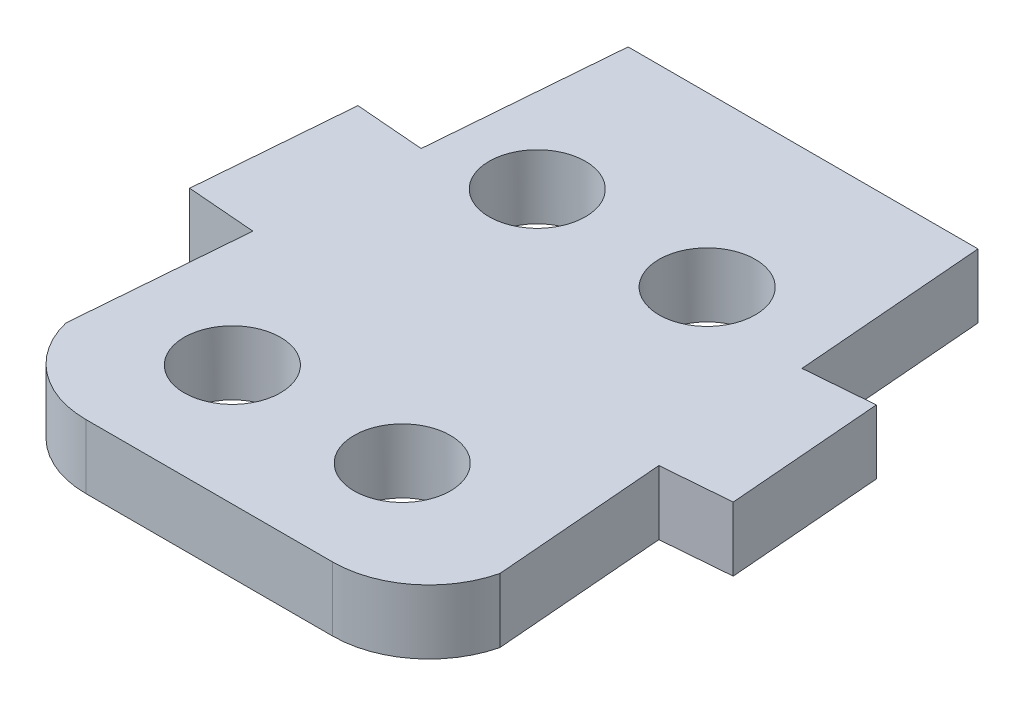
ISO-10303-21;
HEADER;
FILE_DESCRIPTION(('STEP AP214'),'2;1');
FILE_NAME('part.step','',(''),(''),'','','');
FILE_SCHEMA(('AUTOMOTIVE_DESIGN { 1 0 10303 214 1 1 1 1 }'));
ENDSEC;
DATA;
#1=APPLICATION_CONTEXT('core data for automotive mechanical design processes');
#2=APPLICATION_PROTOCOL_DEFINITION('international standard','automotive_design',2000,#1);
#3=PRODUCT_CONTEXT('',#1,'mechanical');
#4=PRODUCT('Part','Part','',(#3));
#5=PRODUCT_RELATED_PRODUCT_CATEGORY('part','',(#4));
#6=PRODUCT_DEFINITION_FORMATION('','',#4);
#7=PRODUCT_DEFINITION_CONTEXT('part definition',#1,'design');
#8=PRODUCT_DEFINITION('design','',#6,#7);
#9=PRODUCT_DEFINITION_SHAPE('','',#8);
#10=(LENGTH_UNIT() NAMED_UNIT(*) SI_UNIT(.MILLI.,.METRE.));
#11=(NAMED_UNIT(*) PLANE_ANGLE_UNIT() SI_UNIT($,.RADIAN.));
#12=(NAMED_UNIT(*) SI_UNIT($,.STERADIAN.) SOLID_ANGLE_UNIT());
#13=UNCERTAINTY_MEASURE_WITH_UNIT(LENGTH_MEASURE(1.E-05),#10,'distance_accuracy_value','');
#14=(GEOMETRIC_REPRESENTATION_CONTEXT(3) GLOBAL_UNCERTAINTY_ASSIGNED_CONTEXT((#13)) GLOBAL_UNIT_ASSIGNED_CONTEXT((#10,
#11,#12)) REPRESENTATION_CONTEXT('',''));
#15=CARTESIAN_POINT('',(0.,0.,0.));
#16=DIRECTION('',(0.,0.,1.));
#17=DIRECTION('',(1.,0.,0.));
#18=AXIS2_PLACEMENT_3D('',#15,#16,#17);
#19=CARTESIAN_POINT('',(-6.06125458711674,-48.,82.5));
#20=DIRECTION('',(0.,1.,0.));
#21=DIRECTION('',(0.,0.,1.));
#22=AXIS2_PLACEMENT_3D('',#19,#20,#21);
#23=CYLINDRICAL_SURFACE('',#22,3.);
#24=CARTESIAN_POINT('',(-6.06125458711674,-48.,82.5));
#25=DIRECTION('',(0.,1.,0.));
#26=DIRECTION('',(0.,0.,1.));
#27=AXIS2_PLACEMENT_3D('',#24,#25,#26);
#28=CIRCLE('',#27,3.);
#29=CARTESIAN_POINT('',(-6.06125458711674,-48.,85.5));
#30=VERTEX_POINT('',#29);
#31=EDGE_CURVE('E233',#30,#30,#28,.T.);
#32=ORIENTED_EDGE('',*,*,#31,.F.);
#33=EDGE_LOOP('',(#32));
#34=FACE_BOUND('',#33,.T.);
#35=CARTESIAN_POINT('',(-6.06125458711674,-44.,82.5));
#36=DIRECTION('',(0.,-1.,0.));
#37=DIRECTION('',(0.,0.,-1.));
#38=AXIS2_PLACEMENT_3D('',#35,#36,#37);
#39=CIRCLE('',#38,3.);
#40=CARTESIAN_POINT('',(-6.06125458711674,-44.,79.5));
#41=VERTEX_POINT('',#40);
#42=EDGE_CURVE('E259',#41,#41,#39,.T.);
#43=ORIENTED_EDGE('',*,*,#42,.F.);
#44=EDGE_LOOP('',(#43));
#45=FACE_BOUND('',#44,.T.);
#46=ADVANCED_FACE('F40',(#34,#45),#23,.F.);
#47=CARTESIAN_POINT('',(4.5257367583805,-48.,82.5));
#48=DIRECTION('',(0.,1.,0.));
#49=DIRECTION('',(0.,0.,1.));
#50=AXIS2_PLACEMENT_3D('',#47,#48,#49);
#51=CYLINDRICAL_SURFACE('',#50,3.);
#52=CARTESIAN_POINT('',(4.5257367583805,-48.,82.5));
#53=DIRECTION('',(0.,1.,0.));
#54=DIRECTION('',(0.,0.,1.));
#55=AXIS2_PLACEMENT_3D('',#52,#53,#54);
#56=CIRCLE('',#55,3.);
#57=CARTESIAN_POINT('',(4.5257367583805,-48.,85.5));
#58=VERTEX_POINT('',#57);
#59=EDGE_CURVE('E241',#58,#58,#56,.T.);
#60=ORIENTED_EDGE('',*,*,#59,.F.);
#61=EDGE_LOOP('',(#60));
#62=FACE_BOUND('',#61,.T.);
#63=CARTESIAN_POINT('',(4.5257367583805,-44.,82.5));
#64=DIRECTION('',(0.,-1.,0.));
#65=DIRECTION('',(0.,0.,-1.));
#66=AXIS2_PLACEMENT_3D('',#63,#64,#65);
#67=CIRCLE('',#66,3.);
#68=CARTESIAN_POINT('',(4.5257367583805,-44.,79.5));
#69=VERTEX_POINT('',#68);
#70=EDGE_CURVE('E222',#69,#69,#67,.T.);
#71=ORIENTED_EDGE('',*,*,#70,.F.);
#72=EDGE_LOOP('',(#71));
#73=FACE_BOUND('',#72,.T.);
#74=ADVANCED_FACE('F349',(#62,#73),#51,.F.);
#75=CARTESIAN_POINT('',(-7.68737021403695,-48.,84.));
#76=DIRECTION('',(0.,-1.,0.));
#77=DIRECTION('',(1.,0.,0.));
#78=AXIS2_PLACEMENT_3D('',#75,#76,#77);
#79=CYLINDRICAL_SURFACE('',#78,6.);
#80=CARTESIAN_POINT('',(-7.68737021403695,-44.,84.));
#81=DIRECTION('',(0.,-1.,0.));
#82=DIRECTION('',(0.,0.,-1.));
#83=AXIS2_PLACEMENT_3D('',#80,#81,#82);
#84=CIRCLE('',#83,6.);
#85=CARTESIAN_POINT('',(-13.5197646184237,-44.,85.4082526448327));
#86=VERTEX_POINT('',#85);
#87=CARTESIAN_POINT('',(-7.68737021403695,-44.,90.));
#88=VERTEX_POINT('',#87);
#89=EDGE_CURVE('E202',#86,#88,#84,.F.);
#90=ORIENTED_EDGE('',*,*,#89,.F.);
#91=DIRECTION('',(0.,-1.,0.));
#92=VECTOR('',#91,1.);
#93=CARTESIAN_POINT('',(-13.5197646184237,-48.,85.4082526448327));
#94=LINE('',#93,#92);
#95=CARTESIAN_POINT('',(-13.5197646184237,-48.,85.4082526448327));
#96=VERTEX_POINT('',#95);
#97=EDGE_CURVE('E168',#86,#96,#94,.T.);
#98=ORIENTED_EDGE('',*,*,#97,.T.);
#99=CARTESIAN_POINT('',(-7.68737021403695,-48.,84.));
#100=DIRECTION('',(0.,-1.,0.));
#101=DIRECTION('',(0.,0.,-1.));
#102=AXIS2_PLACEMENT_3D('',#99,#100,#101);
#103=CIRCLE('',#102,6.);
#104=CARTESIAN_POINT('',(-7.68737021403695,-48.,90.));
#105=VERTEX_POINT('',#104);
#106=EDGE_CURVE('E206',#105,#96,#103,.T.);
#107=ORIENTED_EDGE('',*,*,#106,.F.);
#108=DIRECTION('',(0.,1.,0.));
#109=VECTOR('',#108,1.);
#110=CARTESIAN_POINT('',(-7.68737021403695,-48.,90.));
#111=LINE('',#110,#109);
#112=EDGE_CURVE('E93',#88,#105,#111,.F.);
#113=ORIENTED_EDGE('',*,*,#112,.F.);
#114=EDGE_LOOP('',(#90,#98,#107,#113));
#115=FACE_BOUND('',#114,.T.);
#116=ADVANCED_FACE('F328',(#115),#79,.T.);
#117=CARTESIAN_POINT('',(15.,-48.,90.));
#118=DIRECTION('',(0.,0.,1.));
#119=DIRECTION('',(1.,0.,0.));
#120=AXIS2_PLACEMENT_3D('',#117,#118,#119);
#121=PLANE('',#120);
#122=DIRECTION('',(-1.,0.,0.));
#123=VECTOR('',#122,1.);
#124=CARTESIAN_POINT('',(15.,-48.,90.));
#125=LINE('',#124,#123);
#126=CARTESIAN_POINT('',(7.68737021403695,-48.,90.));
#127=VERTEX_POINT('',#126);
#128=EDGE_CURVE('E269',#127,#105,#125,.T.);
#129=ORIENTED_EDGE('',*,*,#128,.F.);
#130=DIRECTION('',(0.,-1.,0.));
#131=VECTOR('',#130,1.);
#132=CARTESIAN_POINT('',(7.68737021403695,-44.,90.));
#133=LINE('',#132,#131);
#134=CARTESIAN_POINT('',(7.68737021403695,-44.,90.));
#135=VERTEX_POINT('',#134);
#136=EDGE_CURVE('E195',#127,#135,#133,.F.);
#137=ORIENTED_EDGE('',*,*,#136,.T.);
#138=DIRECTION('',(-1.,0.,0.));
#139=VECTOR('',#138,1.);
#140=CARTESIAN_POINT('',(15.,-44.,90.));
#141=LINE('',#140,#139);
#142=EDGE_CURVE('E272',#135,#88,#141,.T.);
#143=ORIENTED_EDGE('',*,*,#142,.T.);
#144=ORIENTED_EDGE('',*,*,#112,.T.);
#145=EDGE_LOOP('',(#129,#137,#143,#144));
#146=FACE_BOUND('',#145,.T.);
#147=ADVANCED_FACE('F340',(#146),#121,.T.);
#148=CARTESIAN_POINT('',(7.68737021403695,-48.,84.));
#149=DIRECTION('',(0.,1.,0.));
#150=DIRECTION('',(-1.,0.,0.));
#151=AXIS2_PLACEMENT_3D('',#148,#149,#150);
#152=CYLINDRICAL_SURFACE('',#151,6.);
#153=CARTESIAN_POINT('',(7.68737021403695,-48.,84.));
#154=DIRECTION('',(0.,-1.,0.));
#155=DIRECTION('',(0.,0.,-1.));
#156=AXIS2_PLACEMENT_3D('',#153,#154,#155);
#157=CIRCLE('',#156,6.);
#158=CARTESIAN_POINT('',(13.5197646184237,-48.,85.4082526448327));
#159=VERTEX_POINT('',#158);
#160=EDGE_CURVE('E236',#159,#127,#157,.T.);
#161=ORIENTED_EDGE('',*,*,#160,.F.);
#162=DIRECTION('',(0.,1.,0.));
#163=VECTOR('',#162,1.);
#164=CARTESIAN_POINT('',(13.5197646184237,-48.,85.4082526448327));
#165=LINE('',#164,#163);
#166=CARTESIAN_POINT('',(13.5197646184237,-44.,85.4082526448327));
#167=VERTEX_POINT('',#166);
#168=EDGE_CURVE('E173',#159,#167,#165,.T.);
#169=ORIENTED_EDGE('',*,*,#168,.T.);
#170=CARTESIAN_POINT('',(7.68737021403695,-44.,84.));
#171=DIRECTION('',(0.,-1.,0.));
#172=DIRECTION('',(0.,0.,-1.));
#173=AXIS2_PLACEMENT_3D('',#170,#171,#172);
#174=CIRCLE('',#173,6.);
#175=EDGE_CURVE('E223',#135,#167,#174,.F.);
#176=ORIENTED_EDGE('',*,*,#175,.F.);
#177=ORIENTED_EDGE('',*,*,#136,.F.);
#178=EDGE_LOOP('',(#161,#169,#176,#177));
#179=FACE_BOUND('',#178,.T.);
#180=ADVANCED_FACE('F339',(#179),#152,.T.);
#181=CARTESIAN_POINT('',(4.5257367583805,-48.,63.5));
#182=DIRECTION('',(0.,1.,0.));
#183=DIRECTION('',(0.,0.,1.));
#184=AXIS2_PLACEMENT_3D('',#181,#182,#183);
#185=CYLINDRICAL_SURFACE('',#184,3.);
#186=CARTESIAN_POINT('',(4.5257367583805,-48.,63.5));
#187=DIRECTION('',(0.,1.,0.));
#188=DIRECTION('',(0.,0.,1.));
#189=AXIS2_PLACEMENT_3D('',#186,#187,#188);
#190=CIRCLE('',#189,3.);
#191=CARTESIAN_POINT('',(4.5257367583805,-48.,66.5));
#192=VERTEX_POINT('',#191);
#193=EDGE_CURVE('E176',#192,#192,#190,.T.);
#194=ORIENTED_EDGE('',*,*,#193,.F.);
#195=EDGE_LOOP('',(#194));
#196=FACE_BOUND('',#195,.T.);
#197=CARTESIAN_POINT('',(4.5257367583805,-44.,63.5));
#198=DIRECTION('',(0.,-1.,0.));
#199=DIRECTION('',(0.,0.,-1.));
#200=AXIS2_PLACEMENT_3D('',#197,#198,#199);
#201=CIRCLE('',#200,3.);
#202=CARTESIAN_POINT('',(4.5257367583805,-44.,60.5));
#203=VERTEX_POINT('',#202);
#204=EDGE_CURVE('E191',#203,#203,#201,.T.);
#205=ORIENTED_EDGE('',*,*,#204,.F.);
#206=EDGE_LOOP('',(#205));
#207=FACE_BOUND('',#206,.T.);
#208=ADVANCED_FACE('F347',(#196,#207),#185,.F.);
#209=CARTESIAN_POINT('',(-6.06125458711674,-48.,63.5));
#210=DIRECTION('',(0.,1.,0.));
#211=DIRECTION('',(0.,0.,1.));
#212=AXIS2_PLACEMENT_3D('',#209,#210,#211);
#213=CYLINDRICAL_SURFACE('',#212,3.);
#214=CARTESIAN_POINT('',(-6.06125458711674,-48.,63.5));
#215=DIRECTION('',(0.,1.,0.));
#216=DIRECTION('',(0.,0.,1.));
#217=AXIS2_PLACEMENT_3D('',#214,#215,#216);
#218=CIRCLE('',#217,3.);
#219=CARTESIAN_POINT('',(-6.06125458711674,-48.,66.5));
#220=VERTEX_POINT('',#219);
#221=EDGE_CURVE('E245',#220,#220,#218,.T.);
#222=ORIENTED_EDGE('',*,*,#221,.F.);
#223=EDGE_LOOP('',(#222));
#224=FACE_BOUND('',#223,.T.);
#225=CARTESIAN_POINT('',(-6.06125458711674,-44.,63.5));
#226=DIRECTION('',(0.,-1.,0.));
#227=DIRECTION('',(0.,0.,-1.));
#228=AXIS2_PLACEMENT_3D('',#225,#226,#227);
#229=CIRCLE('',#228,3.);
#230=CARTESIAN_POINT('',(-6.06125458711674,-44.,60.5));
#231=VERTEX_POINT('',#230);
#232=EDGE_CURVE('E254',#231,#231,#229,.T.);
#233=ORIENTED_EDGE('',*,*,#232,.F.);
#234=EDGE_LOOP('',(#233));
#235=FACE_BOUND('',#234,.T.);
#236=ADVANCED_FACE('F363',(#224,#235),#213,.F.);
#237=CARTESIAN_POINT('',(-12.6489432642371,-49.9335699268317,74.6329914137981));
#238=DIRECTION('',(-0.0805540927453614,0.,0.996750238596396));
#239=DIRECTION('',(0.996750238596396,0.,0.0805540927453614));
#240=AXIS2_PLACEMENT_3D('',#237,#238,#239);
#241=PLANE('',#240);
#242=DIRECTION('',(-0.996750238596396,0.,-0.0805540927453614));
#243=VECTOR('',#242,1.);
#244=CARTESIAN_POINT('',(13.3245011172335,-44.,76.7320801991369));
#245=LINE('',#244,#243);
#246=CARTESIAN_POINT('',(-12.6489432642371,-44.,74.6329914137981));
#247=VERTEX_POINT('',#246);
#248=CARTESIAN_POINT('',(-16.9349692902016,-44.,74.286608814993));
#249=VERTEX_POINT('',#248);
#250=EDGE_CURVE('E207',#247,#249,#245,.T.);
#251=ORIENTED_EDGE('',*,*,#250,.T.);
#252=DIRECTION('',(0.,1.,0.));
#253=VECTOR('',#252,1.);
#254=CARTESIAN_POINT('',(-16.9349692902016,-49.9335699268317,74.286608814993));
#255=LINE('',#254,#253);
#256=CARTESIAN_POINT('',(-16.9349692902016,-48.,74.286608814993));
#257=VERTEX_POINT('',#256);
#258=EDGE_CURVE('E171',#257,#249,#255,.T.);
#259=ORIENTED_EDGE('',*,*,#258,.F.);
#260=DIRECTION('',(-0.996750238596396,0.,-0.0805540927453614));
#261=VECTOR('',#260,1.);
#262=CARTESIAN_POINT('',(13.3245011172335,-48.,76.7320801991369));
#263=LINE('',#262,#261);
#264=CARTESIAN_POINT('',(-12.6489432642371,-48.,74.6329914137981));
#265=VERTEX_POINT('',#264);
#266=EDGE_CURVE('E203',#265,#257,#263,.T.);
#267=ORIENTED_EDGE('',*,*,#266,.F.);
#268=DIRECTION('',(0.,1.,0.));
#269=VECTOR('',#268,1.);
#270=CARTESIAN_POINT('',(-12.6489432642371,-49.9335699268317,74.6329914137981));
#271=LINE('',#270,#269);
#272=EDGE_CURVE('E209',#265,#247,#271,.T.);
#273=ORIENTED_EDGE('',*,*,#272,.T.);
#274=EDGE_LOOP('',(#251,#259,#267,#273));
#275=FACE_BOUND('',#274,.T.);
#276=ADVANCED_FACE('F318',(#275),#241,.T.);
#277=CARTESIAN_POINT('',(-15.4310649299438,-45.,55.6777836290186));
#278=DIRECTION('',(-0.996750238596396,0.,-0.0805540927453614));
#279=DIRECTION('',(0.0805540927453614,0.,-0.996750238596396));
#280=AXIS2_PLACEMENT_3D('',#277,#278,#279);
#281=PLANE('',#280);
#282=DIRECTION('',(0.0805540927453614,0.,-0.996750238596396));
#283=VECTOR('',#282,1.);
#284=CARTESIAN_POINT('',(-15.4310649299438,-48.,55.6777836290186));
#285=LINE('',#284,#283);
#286=CARTESIAN_POINT('',(-16.150968239743,-48.,64.5856338865719));
#287=VERTEX_POINT('',#286);
#288=EDGE_CURVE('E205',#257,#287,#285,.T.);
#289=ORIENTED_EDGE('',*,*,#288,.F.);
#290=ORIENTED_EDGE('',*,*,#258,.T.);
#291=DIRECTION('',(0.0805540927453614,0.,-0.996750238596396));
#292=VECTOR('',#291,1.);
#293=CARTESIAN_POINT('',(-15.4310649299438,-44.,55.6777836290186));
#294=LINE('',#293,#292);
#295=CARTESIAN_POINT('',(-16.150968239743,-44.,64.5856338865719));
#296=VERTEX_POINT('',#295);
#297=EDGE_CURVE('E196',#249,#296,#294,.T.);
#298=ORIENTED_EDGE('',*,*,#297,.T.);
#299=DIRECTION('',(0.,-1.,0.));
#300=VECTOR('',#299,1.);
#301=CARTESIAN_POINT('',(-16.150968239743,-43.7,64.5856338865719));
#302=LINE('',#301,#300);
#303=EDGE_CURVE('E192',#296,#287,#302,.T.);
#304=ORIENTED_EDGE('',*,*,#303,.T.);
#305=EDGE_LOOP('',(#289,#290,#298,#304));
#306=FACE_BOUND('',#305,.T.);
#307=ADVANCED_FACE('F315',(#306),#281,.T.);
#308=CARTESIAN_POINT('',(15.4310649299438,-45.,55.6777836290186));
#309=DIRECTION('',(0.996750238596396,0.,-0.0805540927453614));
#310=DIRECTION('',(-0.0805540927453614,0.,-0.996750238596396));
#311=AXIS2_PLACEMENT_3D('',#308,#309,#310);
#312=PLANE('',#311);
#313=DIRECTION('',(0.,1.,0.));
#314=VECTOR('',#313,1.);
#315=CARTESIAN_POINT('',(16.9349692902016,-49.9335699268317,74.286608814993));
#316=LINE('',#315,#314);
#317=CARTESIAN_POINT('',(16.9349692902016,-48.,74.286608814993));
#318=VERTEX_POINT('',#317);
#319=CARTESIAN_POINT('',(16.9349692902016,-44.,74.286608814993));
#320=VERTEX_POINT('',#319);
#321=EDGE_CURVE('E50',#318,#320,#316,.T.);
#322=ORIENTED_EDGE('',*,*,#321,.F.);
#323=DIRECTION('',(-0.0805540927453614,0.,-0.996750238596396));
#324=VECTOR('',#323,1.);
#325=CARTESIAN_POINT('',(15.4310649299438,-48.,55.6777836290186));
#326=LINE('',#325,#324);
#327=CARTESIAN_POINT('',(16.150968239743,-48.,64.5856338865719));
#328=VERTEX_POINT('',#327);
#329=EDGE_CURVE('E44',#318,#328,#326,.T.);
#330=ORIENTED_EDGE('',*,*,#329,.T.);
#331=DIRECTION('',(0.,-1.,0.));
#332=VECTOR('',#331,1.);
#333=CARTESIAN_POINT('',(16.150968239743,-43.7,64.5856338865719));
#334=LINE('',#333,#332);
#335=CARTESIAN_POINT('',(16.150968239743,-44.,64.5856338865719));
#336=VERTEX_POINT('',#335);
#337=EDGE_CURVE('E145',#336,#328,#334,.T.);
#338=ORIENTED_EDGE('',*,*,#337,.F.);
#339=DIRECTION('',(0.0805540927453614,0.,0.996750238596396));
#340=VECTOR('',#339,1.);
#341=CARTESIAN_POINT('',(15.4310649299438,-44.,55.6777836290186));
#342=LINE('',#341,#340);
#343=EDGE_CURVE('E158',#336,#320,#342,.T.);
#344=ORIENTED_EDGE('',*,*,#343,.T.);
#345=EDGE_LOOP('',(#322,#330,#338,#344));
#346=FACE_BOUND('',#345,.T.);
#347=ADVANCED_FACE('F42',(#346),#312,.T.);
#348=CARTESIAN_POINT('',(12.6489432642371,-49.9335699268317,74.6329914137981));
#349=DIRECTION('',(-0.0805540927453614,0.,-0.996750238596396));
#350=DIRECTION('',(-0.996750238596396,0.,0.0805540927453614));
#351=AXIS2_PLACEMENT_3D('',#348,#349,#350);
#352=PLANE('',#351);
#353=ORIENTED_EDGE('',*,*,#321,.T.);
#354=DIRECTION('',(0.996750238596396,0.,-0.0805540927453614));
#355=VECTOR('',#354,1.);
#356=CARTESIAN_POINT('',(16.4808300270257,-44.,74.3233108642212));
#357=LINE('',#356,#355);
#358=CARTESIAN_POINT('',(12.6489432642371,-44.,74.6329914137981));
#359=VERTEX_POINT('',#358);
#360=EDGE_CURVE('E154',#359,#320,#357,.T.);
#361=ORIENTED_EDGE('',*,*,#360,.F.);
#362=DIRECTION('',(0.,1.,0.));
#363=VECTOR('',#362,1.);
#364=CARTESIAN_POINT('',(12.6489432642371,-49.9335699268317,74.6329914137981));
#365=LINE('',#364,#363);
#366=CARTESIAN_POINT('',(12.6489432642371,-48.,74.6329914137981));
#367=VERTEX_POINT('',#366);
#368=EDGE_CURVE('E228',#367,#359,#365,.T.);
#369=ORIENTED_EDGE('',*,*,#368,.F.);
#370=DIRECTION('',(0.996750238596396,0.,-0.0805540927453614));
#371=VECTOR('',#370,1.);
#372=CARTESIAN_POINT('',(16.4808300270257,-48.,74.3233108642212));
#373=LINE('',#372,#371);
#374=EDGE_CURVE('E11',#367,#318,#373,.T.);
#375=ORIENTED_EDGE('',*,*,#374,.T.);
#376=EDGE_LOOP('',(#353,#361,#369,#375));
#377=FACE_BOUND('',#376,.T.);
#378=ADVANCED_FACE('F335',(#377),#352,.F.);
#379=CARTESIAN_POINT('',(6.57440938416514,0.,-0.53132225383139));
#380=DIRECTION('',(-0.996750238596396,0.,0.0805540927453614));
#381=DIRECTION('',(-0.0805540927453614,0.,-0.996750238596396));
#382=AXIS2_PLACEMENT_3D('',#379,#380,#381);
#383=PLANE('',#382);
#384=DIRECTION('',(-0.0805540927453614,0.,-0.996750238596396));
#385=VECTOR('',#384,1.);
#386=CARTESIAN_POINT('',(11.1681132372115,-44.,56.3096805495769));
#387=LINE('',#386,#385);
#388=EDGE_CURVE('E221',#167,#359,#387,.T.);
#389=ORIENTED_EDGE('',*,*,#388,.F.);
#390=ORIENTED_EDGE('',*,*,#168,.F.);
#391=DIRECTION('',(-0.0805540927453614,0.,-0.996750238596396));
#392=VECTOR('',#391,1.);
#393=CARTESIAN_POINT('',(11.1681132372115,-48.,56.3096805495769));
#394=LINE('',#393,#392);
#395=EDGE_CURVE('E161',#159,#367,#394,.T.);
#396=ORIENTED_EDGE('',*,*,#395,.T.);
#397=ORIENTED_EDGE('',*,*,#368,.T.);
#398=EDGE_LOOP('',(#389,#390,#396,#397));
#399=FACE_BOUND('',#398,.T.);
#400=ADVANCED_FACE('F334',(#399),#383,.F.);
#401=CARTESIAN_POINT('',(-6.57440938416514,0.,-0.53132225383139));
#402=DIRECTION('',(0.996750238596396,0.,0.0805540927453614));
#403=DIRECTION('',(0.0805540927453614,0.,-0.996750238596396));
#404=AXIS2_PLACEMENT_3D('',#401,#402,#403);
#405=PLANE('',#404);
#406=ORIENTED_EDGE('',*,*,#272,.F.);
#407=DIRECTION('',(-0.0805540927453614,0.,0.996750238596396));
#408=VECTOR('',#407,1.);
#409=CARTESIAN_POINT('',(-10.9734443814706,-48.,53.9009112146612));
#410=LINE('',#409,#408);
#411=EDGE_CURVE('E199',#265,#96,#410,.T.);
#412=ORIENTED_EDGE('',*,*,#411,.T.);
#413=ORIENTED_EDGE('',*,*,#97,.F.);
#414=DIRECTION('',(-0.0805540927453614,0.,0.996750238596396));
#415=VECTOR('',#414,1.);
#416=CARTESIAN_POINT('',(-10.9734443814706,-44.,53.9009112146612));
#417=LINE('',#416,#415);
#418=EDGE_CURVE('E182',#247,#86,#417,.T.);
#419=ORIENTED_EDGE('',*,*,#418,.F.);
#420=EDGE_LOOP('',(#406,#412,#413,#419));
#421=FACE_BOUND('',#420,.T.);
#422=ADVANCED_FACE('F324',(#421),#405,.F.);
#423=CARTESIAN_POINT('',(-11.8649422137785,-43.7,64.932016485377));
#424=DIRECTION('',(0.0805540927453614,0.,-0.996750238596396));
#425=DIRECTION('',(-0.996750238596396,0.,-0.0805540927453614));
#426=AXIS2_PLACEMENT_3D('',#423,#424,#425);
#427=PLANE('',#426);
#428=DIRECTION('',(0.996750238596396,0.,0.0805540927453614));
#429=VECTOR('',#428,1.);
#430=CARTESIAN_POINT('',(14.1085021676921,-44.,67.0311052707158));
#431=LINE('',#430,#429);
#432=CARTESIAN_POINT('',(-11.8649422137785,-44.,64.932016485377));
#433=VERTEX_POINT('',#432);
#434=EDGE_CURVE('E183',#296,#433,#431,.T.);
#435=ORIENTED_EDGE('',*,*,#434,.T.);
#436=DIRECTION('',(0.,-1.,0.));
#437=VECTOR('',#436,1.);
#438=CARTESIAN_POINT('',(-11.8649422137785,-43.7,64.932016485377));
#439=LINE('',#438,#437);
#440=CARTESIAN_POINT('',(-11.8649422137785,-48.,64.932016485377));
#441=VERTEX_POINT('',#440);
#442=EDGE_CURVE('E185',#433,#441,#439,.T.);
#443=ORIENTED_EDGE('',*,*,#442,.T.);
#444=DIRECTION('',(0.996750238596396,0.,0.0805540927453614));
#445=VECTOR('',#444,1.);
#446=CARTESIAN_POINT('',(14.1085021676921,-48.,67.0311052707158));
#447=LINE('',#446,#445);
#448=EDGE_CURVE('E187',#287,#441,#447,.T.);
#449=ORIENTED_EDGE('',*,*,#448,.F.);
#450=ORIENTED_EDGE('',*,*,#303,.F.);
#451=EDGE_LOOP('',(#435,#443,#449,#450));
#452=FACE_BOUND('',#451,.T.);
#453=ADVANCED_FACE('F313',(#452),#427,.T.);
#454=CARTESIAN_POINT('',(15.,-48.,56.));
#455=DIRECTION('',(0.,-1.,0.));
#456=DIRECTION('',(0.,0.,-1.));
#457=AXIS2_PLACEMENT_3D('',#454,#455,#456);
#458=PLANE('',#457);
#459=ORIENTED_EDGE('',*,*,#448,.T.);
#460=DIRECTION('',(-0.0805540927453614,0.,0.996750238596396));
#461=VECTOR('',#460,1.);
#462=CARTESIAN_POINT('',(-10.9734443814706,-48.,53.9009112146612));
#463=LINE('',#462,#461);
#464=CARTESIAN_POINT('',(-10.9006356850379,-48.,53.));
#465=VERTEX_POINT('',#464);
#466=EDGE_CURVE('E186',#465,#441,#463,.T.);
#467=ORIENTED_EDGE('',*,*,#466,.F.);
#468=DIRECTION('',(1.,0.,0.));
#469=VECTOR('',#468,1.);
#470=CARTESIAN_POINT('',(-16.7283450717545,-48.,53.));
#471=LINE('',#470,#469);
#472=CARTESIAN_POINT('',(10.9006356850379,-48.,53.));
#473=VERTEX_POINT('',#472);
#474=EDGE_CURVE('E190',#465,#473,#471,.T.);
#475=ORIENTED_EDGE('',*,*,#474,.T.);
#476=DIRECTION('',(-0.0805540927453614,0.,-0.996750238596396));
#477=VECTOR('',#476,1.);
#478=CARTESIAN_POINT('',(11.1681132372115,-48.,56.3096805495769));
#479=LINE('',#478,#477);
#480=CARTESIAN_POINT('',(11.8649422137785,-48.,64.932016485377));
#481=VERTEX_POINT('',#480);
#482=EDGE_CURVE('E218',#481,#473,#479,.T.);
#483=ORIENTED_EDGE('',*,*,#482,.F.);
#484=DIRECTION('',(-0.996750238596396,0.,0.0805540927453614));
#485=VECTOR('',#484,1.);
#486=CARTESIAN_POINT('',(15.6968289765671,-48.,64.6223359358001));
#487=LINE('',#486,#485);
#488=EDGE_CURVE('E162',#328,#481,#487,.T.);
#489=ORIENTED_EDGE('',*,*,#488,.F.);
#490=ORIENTED_EDGE('',*,*,#329,.F.);
#491=ORIENTED_EDGE('',*,*,#374,.F.);
#492=ORIENTED_EDGE('',*,*,#395,.F.);
#493=ORIENTED_EDGE('',*,*,#160,.T.);
#494=ORIENTED_EDGE('',*,*,#128,.T.);
#495=ORIENTED_EDGE('',*,*,#106,.T.);
#496=ORIENTED_EDGE('',*,*,#411,.F.);
#497=ORIENTED_EDGE('',*,*,#266,.T.);
#498=ORIENTED_EDGE('',*,*,#288,.T.);
#499=EDGE_LOOP('',(#459,#467,#475,#483,#489,#490,#491,#492,#493,#494,#495,#496,#497,#498));
#500=FACE_BOUND('',#499,.T.);
#501=ORIENTED_EDGE('',*,*,#193,.T.);
#502=EDGE_LOOP('',(#501));
#503=FACE_BOUND('',#502,.T.);
#504=ORIENTED_EDGE('',*,*,#59,.T.);
#505=EDGE_LOOP('',(#504));
#506=FACE_BOUND('',#505,.T.);
#507=ORIENTED_EDGE('',*,*,#221,.T.);
#508=EDGE_LOOP('',(#507));
#509=FACE_BOUND('',#508,.T.);
#510=ORIENTED_EDGE('',*,*,#31,.T.);
#511=EDGE_LOOP('',(#510));
#512=FACE_BOUND('',#511,.T.);
#513=ADVANCED_FACE('F305',(#500,#503,#506,#509,#512),#458,.T.);
#514=CARTESIAN_POINT('',(11.8649422137785,-43.7,64.932016485377));
#515=DIRECTION('',(0.0805540927453614,0.,0.996750238596396));
#516=DIRECTION('',(0.996750238596396,0.,-0.0805540927453614));
#517=AXIS2_PLACEMENT_3D('',#514,#515,#516);
#518=PLANE('',#517);
#519=ORIENTED_EDGE('',*,*,#488,.T.);
#520=DIRECTION('',(0.,-1.,0.));
#521=VECTOR('',#520,1.);
#522=CARTESIAN_POINT('',(11.8649422137785,-43.7,64.932016485377));
#523=LINE('',#522,#521);
#524=CARTESIAN_POINT('',(11.8649422137785,-44.,64.932016485377));
#525=VERTEX_POINT('',#524);
#526=EDGE_CURVE('E148',#525,#481,#523,.T.);
#527=ORIENTED_EDGE('',*,*,#526,.F.);
#528=DIRECTION('',(-0.996750238596396,0.,0.0805540927453614));
#529=VECTOR('',#528,1.);
#530=CARTESIAN_POINT('',(15.6968289765671,-44.,64.6223359358001));
#531=LINE('',#530,#529);
#532=EDGE_CURVE('E142',#336,#525,#531,.T.);
#533=ORIENTED_EDGE('',*,*,#532,.F.);
#534=ORIENTED_EDGE('',*,*,#337,.T.);
#535=EDGE_LOOP('',(#519,#527,#533,#534));
#536=FACE_BOUND('',#535,.T.);
#537=ADVANCED_FACE('F144',(#536),#518,.F.);
#538=CARTESIAN_POINT('',(-6.57440938416514,0.,-0.531322253831391));
#539=DIRECTION('',(0.996750238596396,0.,0.0805540927453614));
#540=DIRECTION('',(0.0805540927453614,0.,-0.996750238596396));
#541=AXIS2_PLACEMENT_3D('',#538,#539,#540);
#542=PLANE('',#541);
#543=DIRECTION('',(-0.0805540927453614,0.,0.996750238596396));
#544=VECTOR('',#543,1.);
#545=CARTESIAN_POINT('',(-10.9734443814706,-44.,53.9009112146612));
#546=LINE('',#545,#544);
#547=CARTESIAN_POINT('',(-10.9006356850379,-44.,53.));
#548=VERTEX_POINT('',#547);
#549=EDGE_CURVE('E178',#548,#433,#546,.T.);
#550=ORIENTED_EDGE('',*,*,#549,.F.);
#551=DIRECTION('',(0.,-1.,0.));
#552=VECTOR('',#551,1.);
#553=CARTESIAN_POINT('',(-10.9006356850379,-1.00000000000001,53.));
#554=LINE('',#553,#552);
#555=EDGE_CURVE('E80',#548,#465,#554,.T.);
#556=ORIENTED_EDGE('',*,*,#555,.T.);
#557=ORIENTED_EDGE('',*,*,#466,.T.);
#558=ORIENTED_EDGE('',*,*,#442,.F.);
#559=EDGE_LOOP('',(#550,#556,#557,#558));
#560=FACE_BOUND('',#559,.T.);
#561=ADVANCED_FACE('F307',(#560),#542,.F.);
#562=CARTESIAN_POINT('',(6.57440938416514,0.,-0.531322253831391));
#563=DIRECTION('',(-0.996750238596396,0.,0.0805540927453614));
#564=DIRECTION('',(-0.0805540927453614,0.,-0.996750238596396));
#565=AXIS2_PLACEMENT_3D('',#562,#563,#564);
#566=PLANE('',#565);
#567=DIRECTION('',(0.,1.,0.));
#568=VECTOR('',#567,1.);
#569=CARTESIAN_POINT('',(10.9006356850379,-1.00000000000001,53.));
#570=LINE('',#569,#568);
#571=CARTESIAN_POINT('',(10.9006356850379,-44.,53.));
#572=VERTEX_POINT('',#571);
#573=EDGE_CURVE('E215',#473,#572,#570,.T.);
#574=ORIENTED_EDGE('',*,*,#573,.T.);
#575=DIRECTION('',(-0.0805540927453614,0.,-0.996750238596396));
#576=VECTOR('',#575,1.);
#577=CARTESIAN_POINT('',(11.1681132372115,-44.,56.3096805495769));
#578=LINE('',#577,#576);
#579=EDGE_CURVE('E153',#525,#572,#578,.T.);
#580=ORIENTED_EDGE('',*,*,#579,.F.);
#581=ORIENTED_EDGE('',*,*,#526,.T.);
#582=ORIENTED_EDGE('',*,*,#482,.T.);
#583=EDGE_LOOP('',(#574,#580,#581,#582));
#584=FACE_BOUND('',#583,.T.);
#585=ADVANCED_FACE('F303',(#584),#566,.F.);
#586=CARTESIAN_POINT('',(15.,-44.,56.));
#587=DIRECTION('',(0.,-1.,0.));
#588=DIRECTION('',(0.,0.,-1.));
#589=AXIS2_PLACEMENT_3D('',#586,#587,#588);
#590=PLANE('',#589);
#591=ORIENTED_EDGE('',*,*,#418,.T.);
#592=ORIENTED_EDGE('',*,*,#89,.T.);
#593=ORIENTED_EDGE('',*,*,#142,.F.);
#594=ORIENTED_EDGE('',*,*,#175,.T.);
#595=ORIENTED_EDGE('',*,*,#388,.T.);
#596=ORIENTED_EDGE('',*,*,#360,.T.);
#597=ORIENTED_EDGE('',*,*,#343,.F.);
#598=ORIENTED_EDGE('',*,*,#532,.T.);
#599=ORIENTED_EDGE('',*,*,#579,.T.);
#600=DIRECTION('',(1.,0.,0.));
#601=VECTOR('',#600,1.);
#602=CARTESIAN_POINT('',(15.,-44.,53.));
#603=LINE('',#602,#601);
#604=EDGE_CURVE('E226',#548,#572,#603,.T.);
#605=ORIENTED_EDGE('',*,*,#604,.F.);
#606=ORIENTED_EDGE('',*,*,#549,.T.);
#607=ORIENTED_EDGE('',*,*,#434,.F.);
#608=ORIENTED_EDGE('',*,*,#297,.F.);
#609=ORIENTED_EDGE('',*,*,#250,.F.);
#610=EDGE_LOOP('',(#591,#592,#593,#594,#595,#596,#597,#598,#599,#605,#606,#607,#608,#609));
#611=FACE_BOUND('',#610,.T.);
#612=ORIENTED_EDGE('',*,*,#232,.T.);
#613=EDGE_LOOP('',(#612));
#614=FACE_BOUND('',#613,.T.);
#615=ORIENTED_EDGE('',*,*,#204,.T.);
#616=EDGE_LOOP('',(#615));
#617=FACE_BOUND('',#616,.T.);
#618=ORIENTED_EDGE('',*,*,#42,.T.);
#619=EDGE_LOOP('',(#618));
#620=FACE_BOUND('',#619,.T.);
#621=ORIENTED_EDGE('',*,*,#70,.T.);
#622=EDGE_LOOP('',(#621));
#623=FACE_BOUND('',#622,.T.);
#624=ADVANCED_FACE('F164',(#611,#614,#617,#620,#623),#590,.F.);
#625=CARTESIAN_POINT('',(15.,-1.00000000000001,53.));
#626=DIRECTION('',(0.,0.,-1.));
#627=DIRECTION('',(0.,1.,0.));
#628=AXIS2_PLACEMENT_3D('',#625,#626,#627);
#629=PLANE('',#628);
#630=ORIENTED_EDGE('',*,*,#555,.F.);
#631=ORIENTED_EDGE('',*,*,#604,.T.);
#632=ORIENTED_EDGE('',*,*,#573,.F.);
#633=ORIENTED_EDGE('',*,*,#474,.F.);
#634=EDGE_LOOP('',(#630,#631,#632,#633));
#635=FACE_BOUND('',#634,.T.);
#636=ADVANCED_FACE('F299',(#635),#629,.T.);
#637=CLOSED_SHELL('',(#46,#74,#116,#147,#180,#208,#236,#276,#307,#347,#378,#400,#422,#453,#513,
#537,#561,#585,#624,#636));
#638=MANIFOLD_SOLID_BREP('B2',#637);
#639=ADVANCED_BREP_SHAPE_REPRESENTATION('',(#18,#638),#14);
#640=SHAPE_DEFINITION_REPRESENTATION(#9,#639);
ENDSEC;
END-ISO-10303-21;
